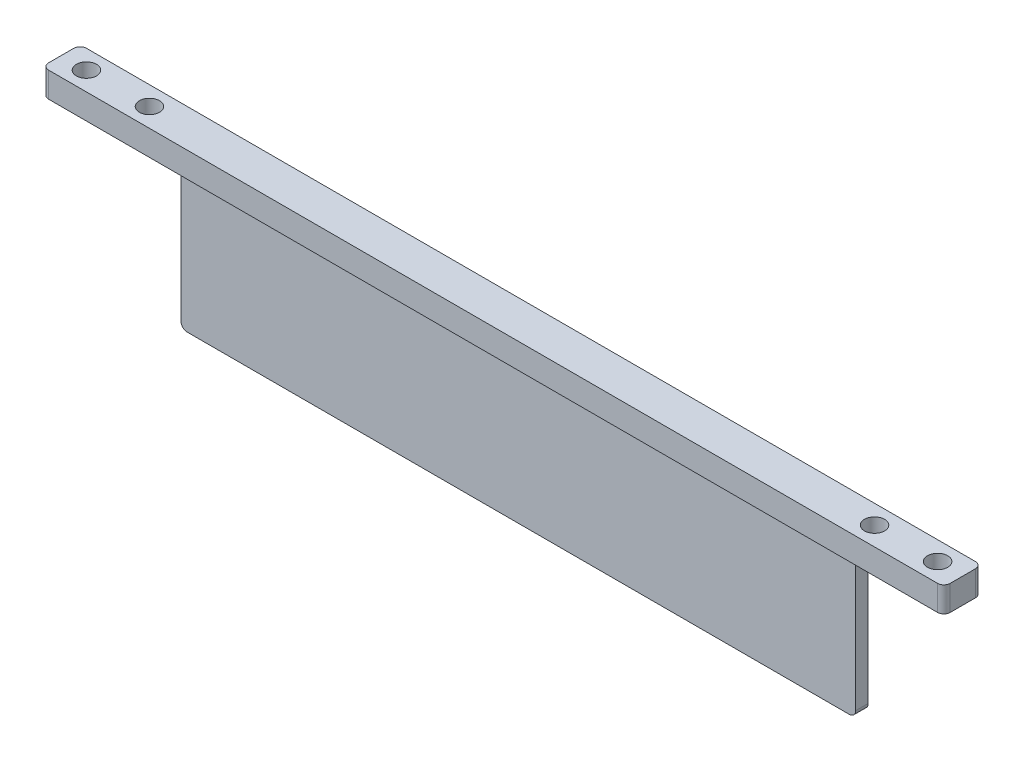
ISO-10303-21;
HEADER;
FILE_DESCRIPTION(('STEP AP214'),'2;1');
FILE_NAME('part.step','',(''),(''),'','','');
FILE_SCHEMA(('AUTOMOTIVE_DESIGN { 1 0 10303 214 1 1 1 1 }'));
ENDSEC;
DATA;
#1=APPLICATION_CONTEXT('core data for automotive mechanical design processes');
#2=APPLICATION_PROTOCOL_DEFINITION('international standard','automotive_design',2000,#1);
#3=PRODUCT_CONTEXT('',#1,'mechanical');
#4=PRODUCT('Part','Part','',(#3));
#5=PRODUCT_RELATED_PRODUCT_CATEGORY('part','',(#4));
#6=PRODUCT_DEFINITION_FORMATION('','',#4);
#7=PRODUCT_DEFINITION_CONTEXT('part definition',#1,'design');
#8=PRODUCT_DEFINITION('design','',#6,#7);
#9=PRODUCT_DEFINITION_SHAPE('','',#8);
#10=(LENGTH_UNIT() NAMED_UNIT(*) SI_UNIT(.MILLI.,.METRE.));
#11=(NAMED_UNIT(*) PLANE_ANGLE_UNIT() SI_UNIT($,.RADIAN.));
#12=(NAMED_UNIT(*) SI_UNIT($,.STERADIAN.) SOLID_ANGLE_UNIT());
#13=UNCERTAINTY_MEASURE_WITH_UNIT(LENGTH_MEASURE(1.E-05),#10,'distance_accuracy_value','');
#14=(GEOMETRIC_REPRESENTATION_CONTEXT(3) GLOBAL_UNCERTAINTY_ASSIGNED_CONTEXT((#13)) GLOBAL_UNIT_ASSIGNED_CONTEXT((#10,
#11,#12)) REPRESENTATION_CONTEXT('',''));
#15=CARTESIAN_POINT('',(0.,0.,0.));
#16=DIRECTION('',(0.,0.,1.));
#17=DIRECTION('',(1.,0.,0.));
#18=AXIS2_PLACEMENT_3D('',#15,#16,#17);
#19=CARTESIAN_POINT('',(0.,0.,0.));
#20=DIRECTION('',(0.,1.,0.));
#21=DIRECTION('',(0.,0.,1.));
#22=AXIS2_PLACEMENT_3D('',#19,#20,#21);
#23=PLANE('',#22);
#24=CARTESIAN_POINT('',(135.,0.,0.));
#25=DIRECTION('',(0.,1.,0.));
#26=DIRECTION('',(0.,0.,1.));
#27=AXIS2_PLACEMENT_3D('',#24,#25,#26);
#28=CIRCLE('',#27,1.59999999999999);
#29=CARTESIAN_POINT('',(135.,0.,1.59999999999999));
#30=VERTEX_POINT('',#29);
#31=EDGE_CURVE('E281',#30,#30,#28,.T.);
#32=ORIENTED_EDGE('',*,*,#31,.T.);
#33=EDGE_LOOP('',(#32));
#34=FACE_BOUND('',#33,.T.);
#35=CARTESIAN_POINT('',(125.,0.,0.));
#36=DIRECTION('',(0.,1.,0.));
#37=DIRECTION('',(0.,0.,1.));
#38=AXIS2_PLACEMENT_3D('',#35,#36,#37);
#39=CIRCLE('',#38,1.59999999999999);
#40=CARTESIAN_POINT('',(125.,0.,1.59999999999999));
#41=VERTEX_POINT('',#40);
#42=EDGE_CURVE('E285',#41,#41,#39,.T.);
#43=ORIENTED_EDGE('',*,*,#42,.T.);
#44=EDGE_LOOP('',(#43));
#45=FACE_BOUND('',#44,.T.);
#46=CARTESIAN_POINT('',(10.,0.,0.));
#47=DIRECTION('',(0.,1.,0.));
#48=DIRECTION('',(0.,0.,1.));
#49=AXIS2_PLACEMENT_3D('',#46,#47,#48);
#50=CIRCLE('',#49,1.6);
#51=CARTESIAN_POINT('',(10.,0.,1.6));
#52=VERTEX_POINT('',#51);
#53=EDGE_CURVE('E291',#52,#52,#50,.T.);
#54=ORIENTED_EDGE('',*,*,#53,.T.);
#55=EDGE_LOOP('',(#54));
#56=FACE_BOUND('',#55,.T.);
#57=CARTESIAN_POINT('',(0.,0.,0.));
#58=DIRECTION('',(0.,1.,0.));
#59=DIRECTION('',(0.,0.,1.));
#60=AXIS2_PLACEMENT_3D('',#57,#58,#59);
#61=CIRCLE('',#60,1.6);
#62=CARTESIAN_POINT('',(0.,0.,1.6));
#63=VERTEX_POINT('',#62);
#64=EDGE_CURVE('E297',#63,#63,#61,.T.);
#65=ORIENTED_EDGE('',*,*,#64,.T.);
#66=EDGE_LOOP('',(#65));
#67=FACE_BOUND('',#66,.T.);
#68=DIRECTION('',(-1.,0.,0.));
#69=VECTOR('',#68,1.);
#70=CARTESIAN_POINT('',(14.,0.,-0.999999999999997));
#71=LINE('',#70,#69);
#72=CARTESIAN_POINT('',(122.,0.,-0.999999999999998));
#73=VERTEX_POINT('',#72);
#74=CARTESIAN_POINT('',(13.,0.,-0.999999999999997));
#75=VERTEX_POINT('',#74);
#76=EDGE_CURVE('E270',#73,#75,#71,.T.);
#77=ORIENTED_EDGE('',*,*,#76,.F.);
#78=DIRECTION('',(0.,0.,1.));
#79=VECTOR('',#78,1.);
#80=CARTESIAN_POINT('',(122.,0.,-3.00000000000001));
#81=LINE('',#80,#79);
#82=CARTESIAN_POINT('',(122.,0.,-3.));
#83=VERTEX_POINT('',#82);
#84=EDGE_CURVE('E207',#73,#83,#81,.F.);
#85=ORIENTED_EDGE('',*,*,#84,.T.);
#86=DIRECTION('',(-1.,0.,0.));
#87=VECTOR('',#86,1.);
#88=CARTESIAN_POINT('',(-4.,0.,-3.));
#89=LINE('',#88,#87);
#90=CARTESIAN_POINT('',(138.,0.,-3.));
#91=VERTEX_POINT('',#90);
#92=EDGE_CURVE('E265',#91,#83,#89,.T.);
#93=ORIENTED_EDGE('',*,*,#92,.F.);
#94=CARTESIAN_POINT('',(138.,0.,-2.));
#95=DIRECTION('',(0.,1.,0.));
#96=DIRECTION('',(0.,0.,1.));
#97=AXIS2_PLACEMENT_3D('',#94,#95,#96);
#98=CIRCLE('',#97,1.);
#99=CARTESIAN_POINT('',(139.,0.,-2.));
#100=VERTEX_POINT('',#99);
#101=EDGE_CURVE('E200',#91,#100,#98,.F.);
#102=ORIENTED_EDGE('',*,*,#101,.T.);
#103=DIRECTION('',(0.,0.,-1.));
#104=VECTOR('',#103,1.);
#105=CARTESIAN_POINT('',(139.,0.,-3.));
#106=LINE('',#105,#104);
#107=CARTESIAN_POINT('',(139.,0.,2.));
#108=VERTEX_POINT('',#107);
#109=EDGE_CURVE('E266',#108,#100,#106,.T.);
#110=ORIENTED_EDGE('',*,*,#109,.F.);
#111=CARTESIAN_POINT('',(138.,0.,2.));
#112=DIRECTION('',(0.,1.,0.));
#113=DIRECTION('',(0.,0.,1.));
#114=AXIS2_PLACEMENT_3D('',#111,#112,#113);
#115=CIRCLE('',#114,1.);
#116=CARTESIAN_POINT('',(138.,0.,3.));
#117=VERTEX_POINT('',#116);
#118=EDGE_CURVE('E198',#108,#117,#115,.F.);
#119=ORIENTED_EDGE('',*,*,#118,.T.);
#120=DIRECTION('',(1.,0.,0.));
#121=VECTOR('',#120,1.);
#122=CARTESIAN_POINT('',(-4.,0.,3.));
#123=LINE('',#122,#121);
#124=CARTESIAN_POINT('',(-3.,0.,3.));
#125=VERTEX_POINT('',#124);
#126=EDGE_CURVE('E314',#125,#117,#123,.T.);
#127=ORIENTED_EDGE('',*,*,#126,.F.);
#128=CARTESIAN_POINT('',(-3.,0.,2.));
#129=DIRECTION('',(0.,1.,0.));
#130=DIRECTION('',(0.,0.,1.));
#131=AXIS2_PLACEMENT_3D('',#128,#129,#130);
#132=CIRCLE('',#131,1.);
#133=CARTESIAN_POINT('',(-4.,0.,2.));
#134=VERTEX_POINT('',#133);
#135=EDGE_CURVE('E188',#125,#134,#132,.F.);
#136=ORIENTED_EDGE('',*,*,#135,.T.);
#137=DIRECTION('',(0.,0.,1.));
#138=VECTOR('',#137,1.);
#139=CARTESIAN_POINT('',(-4.,0.,-3.));
#140=LINE('',#139,#138);
#141=CARTESIAN_POINT('',(-4.,0.,-2.));
#142=VERTEX_POINT('',#141);
#143=EDGE_CURVE('E303',#142,#134,#140,.T.);
#144=ORIENTED_EDGE('',*,*,#143,.F.);
#145=CARTESIAN_POINT('',(-3.,0.,-2.));
#146=DIRECTION('',(0.,1.,0.));
#147=DIRECTION('',(0.,0.,1.));
#148=AXIS2_PLACEMENT_3D('',#145,#146,#147);
#149=CIRCLE('',#148,1.);
#150=CARTESIAN_POINT('',(-3.,0.,-3.));
#151=VERTEX_POINT('',#150);
#152=EDGE_CURVE('E202',#142,#151,#149,.F.);
#153=ORIENTED_EDGE('',*,*,#152,.T.);
#154=CARTESIAN_POINT('',(13.,0.,-3.));
#155=VERTEX_POINT('',#154);
#156=EDGE_CURVE('E194',#155,#151,#89,.T.);
#157=ORIENTED_EDGE('',*,*,#156,.F.);
#158=DIRECTION('',(0.,0.,-1.));
#159=VECTOR('',#158,1.);
#160=CARTESIAN_POINT('',(13.,0.,-0.999999999999997));
#161=LINE('',#160,#159);
#162=EDGE_CURVE('E204',#155,#75,#161,.F.);
#163=ORIENTED_EDGE('',*,*,#162,.T.);
#164=EDGE_LOOP('',(#77,#85,#93,#102,#110,#119,#127,#136,#144,#153,#157,#163));
#165=FACE_BOUND('',#164,.T.);
#166=ADVANCED_FACE('F44',(#34,#45,#56,#67,#165),#23,.F.);
#167=CARTESIAN_POINT('',(0.,4.,0.));
#168=DIRECTION('',(0.,1.,0.));
#169=DIRECTION('',(0.,0.,1.));
#170=AXIS2_PLACEMENT_3D('',#167,#168,#169);
#171=PLANE('',#170);
#172=CARTESIAN_POINT('',(125.,4.,0.));
#173=DIRECTION('',(0.,1.,0.));
#174=DIRECTION('',(0.,0.,1.));
#175=AXIS2_PLACEMENT_3D('',#172,#173,#174);
#176=CIRCLE('',#175,1.59999999999999);
#177=CARTESIAN_POINT('',(125.,4.,1.59999999999999));
#178=VERTEX_POINT('',#177);
#179=EDGE_CURVE('E288',#178,#178,#176,.T.);
#180=ORIENTED_EDGE('',*,*,#179,.F.);
#181=EDGE_LOOP('',(#180));
#182=FACE_BOUND('',#181,.T.);
#183=CARTESIAN_POINT('',(0.,4.,0.));
#184=DIRECTION('',(0.,1.,0.));
#185=DIRECTION('',(0.,0.,1.));
#186=AXIS2_PLACEMENT_3D('',#183,#184,#185);
#187=CIRCLE('',#186,1.6);
#188=CARTESIAN_POINT('',(0.,4.,1.6));
#189=VERTEX_POINT('',#188);
#190=EDGE_CURVE('E300',#189,#189,#187,.T.);
#191=ORIENTED_EDGE('',*,*,#190,.F.);
#192=EDGE_LOOP('',(#191));
#193=FACE_BOUND('',#192,.T.);
#194=DIRECTION('',(-1.,0.,0.));
#195=VECTOR('',#194,1.);
#196=CARTESIAN_POINT('',(-4.,4.,-3.));
#197=LINE('',#196,#195);
#198=CARTESIAN_POINT('',(138.,4.,-3.));
#199=VERTEX_POINT('',#198);
#200=CARTESIAN_POINT('',(-3.,4.,-3.));
#201=VERTEX_POINT('',#200);
#202=EDGE_CURVE('E186',#199,#201,#197,.T.);
#203=ORIENTED_EDGE('',*,*,#202,.T.);
#204=CARTESIAN_POINT('',(-3.,4.,-2.));
#205=DIRECTION('',(0.,1.,0.));
#206=DIRECTION('',(0.,0.,1.));
#207=AXIS2_PLACEMENT_3D('',#204,#205,#206);
#208=CIRCLE('',#207,1.);
#209=CARTESIAN_POINT('',(-4.,4.,-2.));
#210=VERTEX_POINT('',#209);
#211=EDGE_CURVE('E237',#201,#210,#208,.T.);
#212=ORIENTED_EDGE('',*,*,#211,.T.);
#213=DIRECTION('',(0.,0.,1.));
#214=VECTOR('',#213,1.);
#215=CARTESIAN_POINT('',(-4.,4.,-3.));
#216=LINE('',#215,#214);
#217=CARTESIAN_POINT('',(-4.,4.,2.));
#218=VERTEX_POINT('',#217);
#219=EDGE_CURVE('E306',#210,#218,#216,.T.);
#220=ORIENTED_EDGE('',*,*,#219,.T.);
#221=CARTESIAN_POINT('',(-3.,4.,2.));
#222=DIRECTION('',(0.,1.,0.));
#223=DIRECTION('',(0.,0.,1.));
#224=AXIS2_PLACEMENT_3D('',#221,#222,#223);
#225=CIRCLE('',#224,1.);
#226=CARTESIAN_POINT('',(-3.,4.,3.));
#227=VERTEX_POINT('',#226);
#228=EDGE_CURVE('E232',#218,#227,#225,.T.);
#229=ORIENTED_EDGE('',*,*,#228,.T.);
#230=DIRECTION('',(1.,0.,0.));
#231=VECTOR('',#230,1.);
#232=CARTESIAN_POINT('',(-4.,4.,3.));
#233=LINE('',#232,#231);
#234=CARTESIAN_POINT('',(138.,4.,3.));
#235=VERTEX_POINT('',#234);
#236=EDGE_CURVE('E309',#227,#235,#233,.T.);
#237=ORIENTED_EDGE('',*,*,#236,.T.);
#238=CARTESIAN_POINT('',(138.,4.,2.));
#239=DIRECTION('',(0.,1.,0.));
#240=DIRECTION('',(0.,0.,1.));
#241=AXIS2_PLACEMENT_3D('',#238,#239,#240);
#242=CIRCLE('',#241,1.);
#243=CARTESIAN_POINT('',(139.,4.,2.));
#244=VERTEX_POINT('',#243);
#245=EDGE_CURVE('E66',#235,#244,#242,.T.);
#246=ORIENTED_EDGE('',*,*,#245,.T.);
#247=DIRECTION('',(0.,0.,-1.));
#248=VECTOR('',#247,1.);
#249=CARTESIAN_POINT('',(139.,4.,-3.));
#250=LINE('',#249,#248);
#251=CARTESIAN_POINT('',(139.,4.,-2.));
#252=VERTEX_POINT('',#251);
#253=EDGE_CURVE('E191',#244,#252,#250,.T.);
#254=ORIENTED_EDGE('',*,*,#253,.T.);
#255=CARTESIAN_POINT('',(138.,4.,-2.));
#256=DIRECTION('',(0.,1.,0.));
#257=DIRECTION('',(0.,0.,1.));
#258=AXIS2_PLACEMENT_3D('',#255,#256,#257);
#259=CIRCLE('',#258,1.);
#260=EDGE_CURVE('E235',#252,#199,#259,.T.);
#261=ORIENTED_EDGE('',*,*,#260,.T.);
#262=EDGE_LOOP('',(#203,#212,#220,#229,#237,#246,#254,#261));
#263=FACE_BOUND('',#262,.T.);
#264=CARTESIAN_POINT('',(10.,4.,0.));
#265=DIRECTION('',(0.,1.,0.));
#266=DIRECTION('',(0.,0.,1.));
#267=AXIS2_PLACEMENT_3D('',#264,#265,#266);
#268=CIRCLE('',#267,1.6);
#269=CARTESIAN_POINT('',(10.,4.,1.6));
#270=VERTEX_POINT('',#269);
#271=EDGE_CURVE('E294',#270,#270,#268,.T.);
#272=ORIENTED_EDGE('',*,*,#271,.F.);
#273=EDGE_LOOP('',(#272));
#274=FACE_BOUND('',#273,.T.);
#275=CARTESIAN_POINT('',(135.,4.,0.));
#276=DIRECTION('',(0.,1.,0.));
#277=DIRECTION('',(0.,0.,1.));
#278=AXIS2_PLACEMENT_3D('',#275,#276,#277);
#279=CIRCLE('',#278,1.59999999999999);
#280=CARTESIAN_POINT('',(135.,4.,1.59999999999999));
#281=VERTEX_POINT('',#280);
#282=EDGE_CURVE('E282',#281,#281,#279,.T.);
#283=ORIENTED_EDGE('',*,*,#282,.F.);
#284=EDGE_LOOP('',(#283));
#285=FACE_BOUND('',#284,.T.);
#286=ADVANCED_FACE('F324',(#182,#193,#263,#274,#285),#171,.T.);
#287=CARTESIAN_POINT('',(-4.,4.,-3.));
#288=DIRECTION('',(1.,0.,0.));
#289=DIRECTION('',(0.,0.,-1.));
#290=AXIS2_PLACEMENT_3D('',#287,#288,#289);
#291=PLANE('',#290);
#292=ORIENTED_EDGE('',*,*,#219,.F.);
#293=DIRECTION('',(0.,-1.,0.));
#294=VECTOR('',#293,1.);
#295=CARTESIAN_POINT('',(-4.,4.,-2.));
#296=LINE('',#295,#294);
#297=EDGE_CURVE('E229',#210,#142,#296,.T.);
#298=ORIENTED_EDGE('',*,*,#297,.T.);
#299=ORIENTED_EDGE('',*,*,#143,.T.);
#300=DIRECTION('',(0.,-1.,0.));
#301=VECTOR('',#300,1.);
#302=CARTESIAN_POINT('',(-4.,4.,2.));
#303=LINE('',#302,#301);
#304=EDGE_CURVE('E227',#134,#218,#303,.F.);
#305=ORIENTED_EDGE('',*,*,#304,.T.);
#306=EDGE_LOOP('',(#292,#298,#299,#305));
#307=FACE_BOUND('',#306,.T.);
#308=ADVANCED_FACE('F335',(#307),#291,.F.);
#309=CARTESIAN_POINT('',(-4.,4.,3.));
#310=DIRECTION('',(0.,0.,-1.));
#311=DIRECTION('',(-1.,0.,0.));
#312=AXIS2_PLACEMENT_3D('',#309,#310,#311);
#313=PLANE('',#312);
#314=ORIENTED_EDGE('',*,*,#126,.T.);
#315=DIRECTION('',(0.,-1.,0.));
#316=VECTOR('',#315,1.);
#317=CARTESIAN_POINT('',(138.,4.,3.));
#318=LINE('',#317,#316);
#319=EDGE_CURVE('E246',#117,#235,#318,.F.);
#320=ORIENTED_EDGE('',*,*,#319,.T.);
#321=ORIENTED_EDGE('',*,*,#236,.F.);
#322=DIRECTION('',(0.,-1.,0.));
#323=VECTOR('',#322,1.);
#324=CARTESIAN_POINT('',(-3.,4.,3.));
#325=LINE('',#324,#323);
#326=EDGE_CURVE('E243',#227,#125,#325,.T.);
#327=ORIENTED_EDGE('',*,*,#326,.T.);
#328=EDGE_LOOP('',(#314,#320,#321,#327));
#329=FACE_BOUND('',#328,.T.);
#330=ADVANCED_FACE('F341',(#329),#313,.F.);
#331=CARTESIAN_POINT('',(139.,4.,-3.));
#332=DIRECTION('',(-1.,0.,0.));
#333=DIRECTION('',(0.,0.,1.));
#334=AXIS2_PLACEMENT_3D('',#331,#332,#333);
#335=PLANE('',#334);
#336=ORIENTED_EDGE('',*,*,#109,.T.);
#337=DIRECTION('',(0.,-1.,0.));
#338=VECTOR('',#337,1.);
#339=CARTESIAN_POINT('',(139.,4.,-2.));
#340=LINE('',#339,#338);
#341=EDGE_CURVE('E59',#100,#252,#340,.F.);
#342=ORIENTED_EDGE('',*,*,#341,.T.);
#343=ORIENTED_EDGE('',*,*,#253,.F.);
#344=DIRECTION('',(0.,-1.,0.));
#345=VECTOR('',#344,1.);
#346=CARTESIAN_POINT('',(139.,4.,2.));
#347=LINE('',#346,#345);
#348=EDGE_CURVE('E239',#244,#108,#347,.T.);
#349=ORIENTED_EDGE('',*,*,#348,.T.);
#350=EDGE_LOOP('',(#336,#342,#343,#349));
#351=FACE_BOUND('',#350,.T.);
#352=ADVANCED_FACE('F317',(#351),#335,.F.);
#353=CARTESIAN_POINT('',(-4.,4.,-3.));
#354=DIRECTION('',(0.,0.,1.));
#355=DIRECTION('',(1.,0.,0.));
#356=AXIS2_PLACEMENT_3D('',#353,#354,#355);
#357=PLANE('',#356);
#358=DIRECTION('',(0.,1.,0.));
#359=VECTOR('',#358,1.);
#360=CARTESIAN_POINT('',(121.,-40.,-3.));
#361=LINE('',#360,#359);
#362=CARTESIAN_POINT('',(121.,-24.,-3.));
#363=VERTEX_POINT('',#362);
#364=CARTESIAN_POINT('',(121.,-1.,-3.));
#365=VERTEX_POINT('',#364);
#366=EDGE_CURVE('E180',#363,#365,#361,.T.);
#367=ORIENTED_EDGE('',*,*,#366,.F.);
#368=CARTESIAN_POINT('',(120.,-24.,-3.));
#369=DIRECTION('',(0.,0.,1.));
#370=DIRECTION('',(1.,0.,0.));
#371=AXIS2_PLACEMENT_3D('',#368,#369,#370);
#372=CIRCLE('',#371,1.);
#373=CARTESIAN_POINT('',(120.,-25.,-3.));
#374=VERTEX_POINT('',#373);
#375=EDGE_CURVE('E185',#363,#374,#372,.F.);
#376=ORIENTED_EDGE('',*,*,#375,.T.);
#377=DIRECTION('',(-1.,0.,0.));
#378=VECTOR('',#377,1.);
#379=CARTESIAN_POINT('',(14.,-25.,-3.));
#380=LINE('',#379,#378);
#381=CARTESIAN_POINT('',(15.,-25.,-3.));
#382=VERTEX_POINT('',#381);
#383=EDGE_CURVE('E275',#374,#382,#380,.T.);
#384=ORIENTED_EDGE('',*,*,#383,.T.);
#385=CARTESIAN_POINT('',(15.,-24.,-3.));
#386=DIRECTION('',(0.,0.,1.));
#387=DIRECTION('',(1.,0.,0.));
#388=AXIS2_PLACEMENT_3D('',#385,#386,#387);
#389=CIRCLE('',#388,1.);
#390=CARTESIAN_POINT('',(14.,-24.,-3.));
#391=VERTEX_POINT('',#390);
#392=EDGE_CURVE('E218',#382,#391,#389,.F.);
#393=ORIENTED_EDGE('',*,*,#392,.T.);
#394=DIRECTION('',(0.,1.,0.));
#395=VECTOR('',#394,1.);
#396=CARTESIAN_POINT('',(14.,-40.,-3.));
#397=LINE('',#396,#395);
#398=CARTESIAN_POINT('',(14.,-1.,-3.));
#399=VERTEX_POINT('',#398);
#400=EDGE_CURVE('E258',#391,#399,#397,.T.);
#401=ORIENTED_EDGE('',*,*,#400,.T.);
#402=CARTESIAN_POINT('',(13.,-1.,-3.));
#403=DIRECTION('',(0.,0.,1.));
#404=DIRECTION('',(1.,0.,0.));
#405=AXIS2_PLACEMENT_3D('',#402,#403,#404);
#406=CIRCLE('',#405,1.);
#407=EDGE_CURVE('E52',#399,#155,#406,.T.);
#408=ORIENTED_EDGE('',*,*,#407,.T.);
#409=ORIENTED_EDGE('',*,*,#156,.T.);
#410=DIRECTION('',(0.,-1.,0.));
#411=VECTOR('',#410,1.);
#412=CARTESIAN_POINT('',(-3.,4.,-3.));
#413=LINE('',#412,#411);
#414=EDGE_CURVE('E216',#151,#201,#413,.F.);
#415=ORIENTED_EDGE('',*,*,#414,.T.);
#416=ORIENTED_EDGE('',*,*,#202,.F.);
#417=DIRECTION('',(0.,-1.,0.));
#418=VECTOR('',#417,1.);
#419=CARTESIAN_POINT('',(138.,4.,-3.));
#420=LINE('',#419,#418);
#421=EDGE_CURVE('E169',#199,#91,#420,.T.);
#422=ORIENTED_EDGE('',*,*,#421,.T.);
#423=ORIENTED_EDGE('',*,*,#92,.T.);
#424=CARTESIAN_POINT('',(122.,-1.,-3.));
#425=DIRECTION('',(0.,0.,1.));
#426=DIRECTION('',(1.,0.,0.));
#427=AXIS2_PLACEMENT_3D('',#424,#425,#426);
#428=CIRCLE('',#427,1.);
#429=EDGE_CURVE('E250',#83,#365,#428,.T.);
#430=ORIENTED_EDGE('',*,*,#429,.T.);
#431=EDGE_LOOP('',(#367,#376,#384,#393,#401,#408,#409,#415,#416,#422,#423,#430));
#432=FACE_BOUND('',#431,.T.);
#433=ADVANCED_FACE('F255',(#432),#357,.F.);
#434=CARTESIAN_POINT('',(0.,4.,0.));
#435=DIRECTION('',(0.,-1.,0.));
#436=DIRECTION('',(0.,0.,-1.));
#437=AXIS2_PLACEMENT_3D('',#434,#435,#436);
#438=CYLINDRICAL_SURFACE('',#437,1.6);
#439=ORIENTED_EDGE('',*,*,#190,.T.);
#440=EDGE_LOOP('',(#439));
#441=FACE_BOUND('',#440,.T.);
#442=ORIENTED_EDGE('',*,*,#64,.F.);
#443=EDGE_LOOP('',(#442));
#444=FACE_BOUND('',#443,.T.);
#445=ADVANCED_FACE('F365',(#441,#444),#438,.F.);
#446=CARTESIAN_POINT('',(10.,4.,0.));
#447=DIRECTION('',(0.,-1.,0.));
#448=DIRECTION('',(0.,0.,-1.));
#449=AXIS2_PLACEMENT_3D('',#446,#447,#448);
#450=CYLINDRICAL_SURFACE('',#449,1.6);
#451=ORIENTED_EDGE('',*,*,#271,.T.);
#452=EDGE_LOOP('',(#451));
#453=FACE_BOUND('',#452,.T.);
#454=ORIENTED_EDGE('',*,*,#53,.F.);
#455=EDGE_LOOP('',(#454));
#456=FACE_BOUND('',#455,.T.);
#457=ADVANCED_FACE('F498',(#453,#456),#450,.F.);
#458=CARTESIAN_POINT('',(125.,4.,0.));
#459=DIRECTION('',(0.,-1.,0.));
#460=DIRECTION('',(0.,0.,-1.));
#461=AXIS2_PLACEMENT_3D('',#458,#459,#460);
#462=CYLINDRICAL_SURFACE('',#461,1.59999999999999);
#463=ORIENTED_EDGE('',*,*,#179,.T.);
#464=EDGE_LOOP('',(#463));
#465=FACE_BOUND('',#464,.T.);
#466=ORIENTED_EDGE('',*,*,#42,.F.);
#467=EDGE_LOOP('',(#466));
#468=FACE_BOUND('',#467,.T.);
#469=ADVANCED_FACE('F489',(#465,#468),#462,.F.);
#470=CARTESIAN_POINT('',(135.,4.,0.));
#471=DIRECTION('',(0.,-1.,0.));
#472=DIRECTION('',(0.,0.,-1.));
#473=AXIS2_PLACEMENT_3D('',#470,#471,#472);
#474=CYLINDRICAL_SURFACE('',#473,1.59999999999999);
#475=ORIENTED_EDGE('',*,*,#282,.T.);
#476=EDGE_LOOP('',(#475));
#477=FACE_BOUND('',#476,.T.);
#478=ORIENTED_EDGE('',*,*,#31,.F.);
#479=EDGE_LOOP('',(#478));
#480=FACE_BOUND('',#479,.T.);
#481=ADVANCED_FACE('F471',(#477,#480),#474,.F.);
#482=CARTESIAN_POINT('',(14.,-40.,-3.));
#483=DIRECTION('',(1.,0.,0.));
#484=DIRECTION('',(0.,0.,-1.));
#485=AXIS2_PLACEMENT_3D('',#482,#483,#484);
#486=PLANE('',#485);
#487=ORIENTED_EDGE('',*,*,#400,.F.);
#488=DIRECTION('',(0.,0.,1.));
#489=VECTOR('',#488,1.);
#490=CARTESIAN_POINT('',(14.,-24.,-3.));
#491=LINE('',#490,#489);
#492=CARTESIAN_POINT('',(14.,-24.,-0.999999999999997));
#493=VERTEX_POINT('',#492);
#494=EDGE_CURVE('E224',#391,#493,#491,.T.);
#495=ORIENTED_EDGE('',*,*,#494,.T.);
#496=DIRECTION('',(0.,1.,0.));
#497=VECTOR('',#496,1.);
#498=CARTESIAN_POINT('',(14.,-40.,-0.999999999999997));
#499=LINE('',#498,#497);
#500=CARTESIAN_POINT('',(14.,-1.,-0.999999999999997));
#501=VERTEX_POINT('',#500);
#502=EDGE_CURVE('E181',#493,#501,#499,.T.);
#503=ORIENTED_EDGE('',*,*,#502,.T.);
#504=DIRECTION('',(0.,0.,-1.));
#505=VECTOR('',#504,1.);
#506=CARTESIAN_POINT('',(14.,-1.,-3.));
#507=LINE('',#506,#505);
#508=EDGE_CURVE('E221',#501,#399,#507,.T.);
#509=ORIENTED_EDGE('',*,*,#508,.T.);
#510=EDGE_LOOP('',(#487,#495,#503,#509));
#511=FACE_BOUND('',#510,.T.);
#512=ADVANCED_FACE('F272',(#511),#486,.F.);
#513=CARTESIAN_POINT('',(121.,-40.,-3.));
#514=DIRECTION('',(-1.,0.,0.));
#515=DIRECTION('',(0.,0.,1.));
#516=AXIS2_PLACEMENT_3D('',#513,#514,#515);
#517=PLANE('',#516);
#518=ORIENTED_EDGE('',*,*,#366,.T.);
#519=DIRECTION('',(0.,0.,1.));
#520=VECTOR('',#519,1.);
#521=CARTESIAN_POINT('',(121.,-1.,-0.999999999999998));
#522=LINE('',#521,#520);
#523=CARTESIAN_POINT('',(121.,-1.,-0.999999999999998));
#524=VERTEX_POINT('',#523);
#525=EDGE_CURVE('E179',#365,#524,#522,.T.);
#526=ORIENTED_EDGE('',*,*,#525,.T.);
#527=DIRECTION('',(0.,1.,0.));
#528=VECTOR('',#527,1.);
#529=CARTESIAN_POINT('',(121.,-40.,-0.999999999999998));
#530=LINE('',#529,#528);
#531=CARTESIAN_POINT('',(121.,-24.,-0.999999999999998));
#532=VERTEX_POINT('',#531);
#533=EDGE_CURVE('E162',#532,#524,#530,.T.);
#534=ORIENTED_EDGE('',*,*,#533,.F.);
#535=DIRECTION('',(0.,0.,1.));
#536=VECTOR('',#535,1.);
#537=CARTESIAN_POINT('',(121.,-24.,-3.));
#538=LINE('',#537,#536);
#539=EDGE_CURVE('E176',#532,#363,#538,.F.);
#540=ORIENTED_EDGE('',*,*,#539,.T.);
#541=EDGE_LOOP('',(#518,#526,#534,#540));
#542=FACE_BOUND('',#541,.T.);
#543=ADVANCED_FACE('F175',(#542),#517,.F.);
#544=CARTESIAN_POINT('',(14.,-40.,-0.999999999999997));
#545=DIRECTION('',(0.,0.,-1.));
#546=DIRECTION('',(-1.,0.,0.));
#547=AXIS2_PLACEMENT_3D('',#544,#545,#546);
#548=PLANE('',#547);
#549=DIRECTION('',(-1.,0.,0.));
#550=VECTOR('',#549,1.);
#551=CARTESIAN_POINT('',(14.,-25.,-0.999999999999996));
#552=LINE('',#551,#550);
#553=CARTESIAN_POINT('',(120.,-25.,-0.999999999999996));
#554=VERTEX_POINT('',#553);
#555=CARTESIAN_POINT('',(15.,-25.,-0.999999999999996));
#556=VERTEX_POINT('',#555);
#557=EDGE_CURVE('E164',#554,#556,#552,.T.);
#558=ORIENTED_EDGE('',*,*,#557,.F.);
#559=CARTESIAN_POINT('',(120.,-24.,-0.999999999999998));
#560=DIRECTION('',(0.,0.,-1.));
#561=DIRECTION('',(-1.,0.,0.));
#562=AXIS2_PLACEMENT_3D('',#559,#560,#561);
#563=CIRCLE('',#562,1.);
#564=EDGE_CURVE('E158',#554,#532,#563,.F.);
#565=ORIENTED_EDGE('',*,*,#564,.T.);
#566=ORIENTED_EDGE('',*,*,#533,.T.);
#567=CARTESIAN_POINT('',(122.,-1.,-0.999999999999998));
#568=DIRECTION('',(0.,0.,-1.));
#569=DIRECTION('',(-1.,0.,0.));
#570=AXIS2_PLACEMENT_3D('',#567,#568,#569);
#571=CIRCLE('',#570,1.);
#572=EDGE_CURVE('E248',#524,#73,#571,.T.);
#573=ORIENTED_EDGE('',*,*,#572,.T.);
#574=ORIENTED_EDGE('',*,*,#76,.T.);
#575=CARTESIAN_POINT('',(13.,-1.,-0.999999999999997));
#576=DIRECTION('',(0.,0.,-1.));
#577=DIRECTION('',(-1.,0.,0.));
#578=AXIS2_PLACEMENT_3D('',#575,#576,#577);
#579=CIRCLE('',#578,1.);
#580=EDGE_CURVE('E11',#75,#501,#579,.T.);
#581=ORIENTED_EDGE('',*,*,#580,.T.);
#582=ORIENTED_EDGE('',*,*,#502,.F.);
#583=CARTESIAN_POINT('',(15.,-24.,-0.999999999999997));
#584=DIRECTION('',(0.,0.,-1.));
#585=DIRECTION('',(-1.,0.,0.));
#586=AXIS2_PLACEMENT_3D('',#583,#584,#585);
#587=CIRCLE('',#586,1.);
#588=EDGE_CURVE('E170',#493,#556,#587,.F.);
#589=ORIENTED_EDGE('',*,*,#588,.T.);
#590=EDGE_LOOP('',(#558,#565,#566,#573,#574,#581,#582,#589));
#591=FACE_BOUND('',#590,.T.);
#592=ADVANCED_FACE('F160',(#591),#548,.F.);
#593=CARTESIAN_POINT('',(14.,-25.,-3.));
#594=DIRECTION('',(0.,1.,0.));
#595=DIRECTION('',(0.,0.,1.));
#596=AXIS2_PLACEMENT_3D('',#593,#594,#595);
#597=PLANE('',#596);
#598=ORIENTED_EDGE('',*,*,#383,.F.);
#599=DIRECTION('',(0.,0.,1.));
#600=VECTOR('',#599,1.);
#601=CARTESIAN_POINT('',(120.,-25.,-3.00000000000074));
#602=LINE('',#601,#600);
#603=EDGE_CURVE('E211',#374,#554,#602,.T.);
#604=ORIENTED_EDGE('',*,*,#603,.T.);
#605=ORIENTED_EDGE('',*,*,#557,.T.);
#606=DIRECTION('',(0.,0.,1.));
#607=VECTOR('',#606,1.);
#608=CARTESIAN_POINT('',(15.,-25.,-3.));
#609=LINE('',#608,#607);
#610=EDGE_CURVE('E209',#556,#382,#609,.F.);
#611=ORIENTED_EDGE('',*,*,#610,.T.);
#612=EDGE_LOOP('',(#598,#604,#605,#611));
#613=FACE_BOUND('',#612,.T.);
#614=ADVANCED_FACE('F375',(#613),#597,.F.);
#615=CARTESIAN_POINT('',(122.,-1.,-3.00000000000001));
#616=DIRECTION('',(0.,0.,-1.));
#617=DIRECTION('',(-1.,0.,0.));
#618=AXIS2_PLACEMENT_3D('',#615,#616,#617);
#619=CYLINDRICAL_SURFACE('',#618,1.);
#620=ORIENTED_EDGE('',*,*,#429,.F.);
#621=ORIENTED_EDGE('',*,*,#84,.F.);
#622=ORIENTED_EDGE('',*,*,#572,.F.);
#623=ORIENTED_EDGE('',*,*,#525,.F.);
#624=EDGE_LOOP('',(#620,#621,#622,#623));
#625=FACE_BOUND('',#624,.T.);
#626=ADVANCED_FACE('F372',(#625),#619,.F.);
#627=CARTESIAN_POINT('',(120.,-24.,-3.00000000000074));
#628=DIRECTION('',(0.,0.,1.));
#629=DIRECTION('',(1.,0.,0.));
#630=AXIS2_PLACEMENT_3D('',#627,#628,#629);
#631=CYLINDRICAL_SURFACE('',#630,1.);
#632=ORIENTED_EDGE('',*,*,#375,.F.);
#633=ORIENTED_EDGE('',*,*,#539,.F.);
#634=ORIENTED_EDGE('',*,*,#564,.F.);
#635=ORIENTED_EDGE('',*,*,#603,.F.);
#636=EDGE_LOOP('',(#632,#633,#634,#635));
#637=FACE_BOUND('',#636,.T.);
#638=ADVANCED_FACE('F184',(#637),#631,.T.);
#639=CARTESIAN_POINT('',(15.,-24.,-3.));
#640=DIRECTION('',(0.,0.,1.));
#641=DIRECTION('',(1.,0.,0.));
#642=AXIS2_PLACEMENT_3D('',#639,#640,#641);
#643=CYLINDRICAL_SURFACE('',#642,1.);
#644=ORIENTED_EDGE('',*,*,#392,.F.);
#645=ORIENTED_EDGE('',*,*,#610,.F.);
#646=ORIENTED_EDGE('',*,*,#588,.F.);
#647=ORIENTED_EDGE('',*,*,#494,.F.);
#648=EDGE_LOOP('',(#644,#645,#646,#647));
#649=FACE_BOUND('',#648,.T.);
#650=ADVANCED_FACE('F379',(#649),#643,.T.);
#651=CARTESIAN_POINT('',(13.,-1.,-3.));
#652=DIRECTION('',(0.,0.,1.));
#653=DIRECTION('',(1.,0.,0.));
#654=AXIS2_PLACEMENT_3D('',#651,#652,#653);
#655=CYLINDRICAL_SURFACE('',#654,1.);
#656=ORIENTED_EDGE('',*,*,#580,.F.);
#657=ORIENTED_EDGE('',*,*,#162,.F.);
#658=ORIENTED_EDGE('',*,*,#407,.F.);
#659=ORIENTED_EDGE('',*,*,#508,.F.);
#660=EDGE_LOOP('',(#656,#657,#658,#659));
#661=FACE_BOUND('',#660,.T.);
#662=ADVANCED_FACE('F267',(#661),#655,.F.);
#663=CARTESIAN_POINT('',(-3.,4.,-2.));
#664=DIRECTION('',(0.,-1.,0.));
#665=DIRECTION('',(0.,0.,-1.));
#666=AXIS2_PLACEMENT_3D('',#663,#664,#665);
#667=CYLINDRICAL_SURFACE('',#666,1.);
#668=ORIENTED_EDGE('',*,*,#211,.F.);
#669=ORIENTED_EDGE('',*,*,#414,.F.);
#670=ORIENTED_EDGE('',*,*,#152,.F.);
#671=ORIENTED_EDGE('',*,*,#297,.F.);
#672=EDGE_LOOP('',(#668,#669,#670,#671));
#673=FACE_BOUND('',#672,.T.);
#674=ADVANCED_FACE('F330',(#673),#667,.T.);
#675=CARTESIAN_POINT('',(138.,4.,-2.));
#676=DIRECTION('',(0.,-1.,0.));
#677=DIRECTION('',(0.,0.,-1.));
#678=AXIS2_PLACEMENT_3D('',#675,#676,#677);
#679=CYLINDRICAL_SURFACE('',#678,1.);
#680=ORIENTED_EDGE('',*,*,#260,.F.);
#681=ORIENTED_EDGE('',*,*,#341,.F.);
#682=ORIENTED_EDGE('',*,*,#101,.F.);
#683=ORIENTED_EDGE('',*,*,#421,.F.);
#684=EDGE_LOOP('',(#680,#681,#682,#683));
#685=FACE_BOUND('',#684,.T.);
#686=ADVANCED_FACE('F321',(#685),#679,.T.);
#687=CARTESIAN_POINT('',(138.,4.,2.));
#688=DIRECTION('',(0.,-1.,0.));
#689=DIRECTION('',(0.,0.,-1.));
#690=AXIS2_PLACEMENT_3D('',#687,#688,#689);
#691=CYLINDRICAL_SURFACE('',#690,1.);
#692=ORIENTED_EDGE('',*,*,#245,.F.);
#693=ORIENTED_EDGE('',*,*,#319,.F.);
#694=ORIENTED_EDGE('',*,*,#118,.F.);
#695=ORIENTED_EDGE('',*,*,#348,.F.);
#696=EDGE_LOOP('',(#692,#693,#694,#695));
#697=FACE_BOUND('',#696,.T.);
#698=ADVANCED_FACE('F345',(#697),#691,.T.);
#699=CARTESIAN_POINT('',(-3.,4.,2.));
#700=DIRECTION('',(0.,-1.,0.));
#701=DIRECTION('',(0.,0.,-1.));
#702=AXIS2_PLACEMENT_3D('',#699,#700,#701);
#703=CYLINDRICAL_SURFACE('',#702,1.);
#704=ORIENTED_EDGE('',*,*,#228,.F.);
#705=ORIENTED_EDGE('',*,*,#304,.F.);
#706=ORIENTED_EDGE('',*,*,#135,.F.);
#707=ORIENTED_EDGE('',*,*,#326,.F.);
#708=EDGE_LOOP('',(#704,#705,#706,#707));
#709=FACE_BOUND('',#708,.T.);
#710=ADVANCED_FACE('F46',(#709),#703,.T.);
#711=CLOSED_SHELL('',(#166,#286,#308,#330,#352,#433,#445,#457,#469,#481,#512,#543,#592,#614,
#626,#638,#650,#662,#674,#686,#698,#710));
#712=MANIFOLD_SOLID_BREP('B2',#711);
#713=ADVANCED_BREP_SHAPE_REPRESENTATION('',(#18,#712),#14);
#714=SHAPE_DEFINITION_REPRESENTATION(#9,#713);
ENDSEC;
END-ISO-10303-21;
